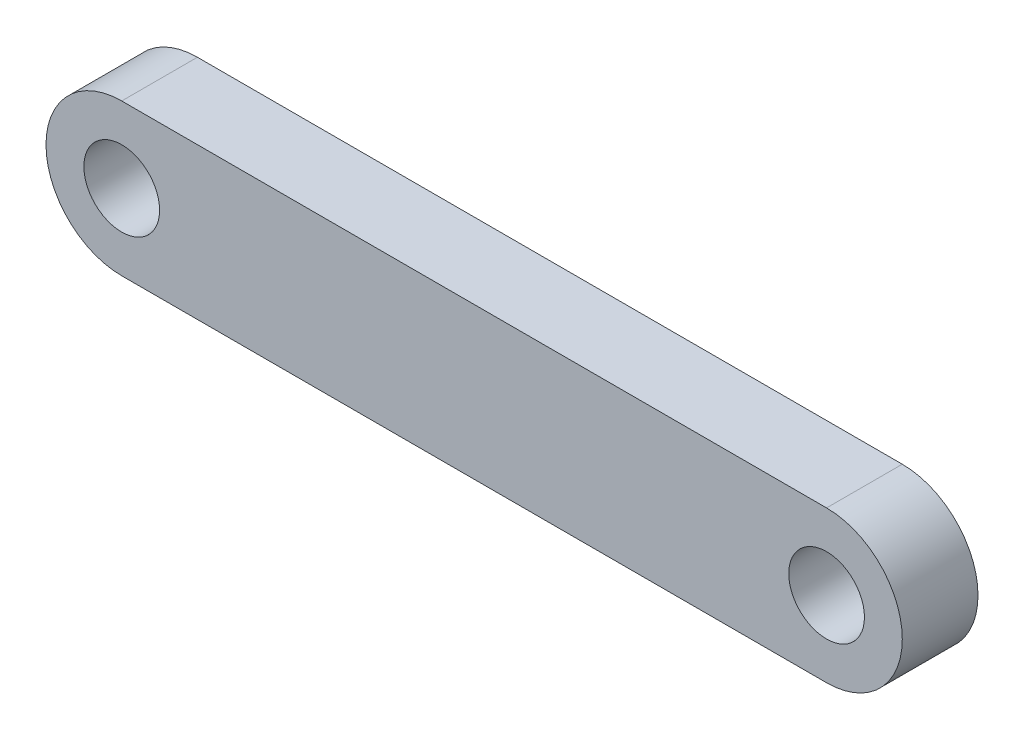
ISO-10303-21;
HEADER;
FILE_DESCRIPTION(('STEP AP214'),'2;1');
FILE_NAME('part.step','',(''),(''),'','','');
FILE_SCHEMA(('AUTOMOTIVE_DESIGN { 1 0 10303 214 1 1 1 1 }'));
ENDSEC;
DATA;
#1=APPLICATION_CONTEXT('core data for automotive mechanical design processes');
#2=APPLICATION_PROTOCOL_DEFINITION('international standard','automotive_design',2000,#1);
#3=PRODUCT_CONTEXT('',#1,'mechanical');
#4=PRODUCT('Part','Part','',(#3));
#5=PRODUCT_RELATED_PRODUCT_CATEGORY('part','',(#4));
#6=PRODUCT_DEFINITION_FORMATION('','',#4);
#7=PRODUCT_DEFINITION_CONTEXT('part definition',#1,'design');
#8=PRODUCT_DEFINITION('design','',#6,#7);
#9=PRODUCT_DEFINITION_SHAPE('','',#8);
#10=(LENGTH_UNIT() NAMED_UNIT(*) SI_UNIT(.MILLI.,.METRE.));
#11=(NAMED_UNIT(*) PLANE_ANGLE_UNIT() SI_UNIT($,.RADIAN.));
#12=(NAMED_UNIT(*) SI_UNIT($,.STERADIAN.) SOLID_ANGLE_UNIT());
#13=UNCERTAINTY_MEASURE_WITH_UNIT(LENGTH_MEASURE(1.E-05),#10,'distance_accuracy_value','');
#14=(GEOMETRIC_REPRESENTATION_CONTEXT(3) GLOBAL_UNCERTAINTY_ASSIGNED_CONTEXT((#13)) GLOBAL_UNIT_ASSIGNED_CONTEXT((#10,
#11,#12)) REPRESENTATION_CONTEXT('',''));
#15=CARTESIAN_POINT('',(0.,0.,0.));
#16=DIRECTION('',(0.,0.,1.));
#17=DIRECTION('',(1.,0.,0.));
#18=AXIS2_PLACEMENT_3D('',#15,#16,#17);
#19=CARTESIAN_POINT('',(0.,0.,2.));
#20=DIRECTION('',(0.,0.,1.));
#21=DIRECTION('',(1.,0.,0.));
#22=AXIS2_PLACEMENT_3D('',#19,#20,#21);
#23=PLANE('',#22);
#24=CARTESIAN_POINT('',(0.,0.,2.));
#25=DIRECTION('',(0.,0.,1.));
#26=DIRECTION('',(1.,0.,0.));
#27=AXIS2_PLACEMENT_3D('',#24,#25,#26);
#28=CIRCLE('',#27,1.);
#29=CARTESIAN_POINT('',(1.,0.,2.));
#30=VERTEX_POINT('',#29);
#31=EDGE_CURVE('E101',#30,#30,#28,.T.);
#32=ORIENTED_EDGE('',*,*,#31,.F.);
#33=EDGE_LOOP('',(#32));
#34=FACE_BOUND('',#33,.T.);
#35=CARTESIAN_POINT('',(0.,0.,2.));
#36=DIRECTION('',(0.,0.,1.));
#37=DIRECTION('',(1.,0.,0.));
#38=AXIS2_PLACEMENT_3D('',#35,#36,#37);
#39=CIRCLE('',#38,2.);
#40=CARTESIAN_POINT('',(0.,2.,2.));
#41=VERTEX_POINT('',#40);
#42=CARTESIAN_POINT('',(0.,-2.,2.));
#43=VERTEX_POINT('',#42);
#44=EDGE_CURVE('E86',#41,#43,#39,.T.);
#45=ORIENTED_EDGE('',*,*,#44,.T.);
#46=DIRECTION('',(1.,0.,0.));
#47=VECTOR('',#46,1.);
#48=CARTESIAN_POINT('',(0.,-2.,2.));
#49=LINE('',#48,#47);
#50=CARTESIAN_POINT('',(18.62,-2.,2.));
#51=VERTEX_POINT('',#50);
#52=EDGE_CURVE('E81',#43,#51,#49,.T.);
#53=ORIENTED_EDGE('',*,*,#52,.T.);
#54=CARTESIAN_POINT('',(18.62,0.,2.));
#55=DIRECTION('',(0.,0.,1.));
#56=DIRECTION('',(1.,0.,0.));
#57=AXIS2_PLACEMENT_3D('',#54,#55,#56);
#58=CIRCLE('',#57,2.);
#59=CARTESIAN_POINT('',(18.62,2.,2.));
#60=VERTEX_POINT('',#59);
#61=EDGE_CURVE('E84',#51,#60,#58,.T.);
#62=ORIENTED_EDGE('',*,*,#61,.T.);
#63=DIRECTION('',(-1.,0.,0.));
#64=VECTOR('',#63,1.);
#65=CARTESIAN_POINT('',(0.,2.,2.));
#66=LINE('',#65,#64);
#67=EDGE_CURVE('E51',#60,#41,#66,.T.);
#68=ORIENTED_EDGE('',*,*,#67,.T.);
#69=EDGE_LOOP('',(#45,#53,#62,#68));
#70=FACE_BOUND('',#69,.T.);
#71=CARTESIAN_POINT('',(18.62,0.,2.));
#72=DIRECTION('',(0.,0.,1.));
#73=DIRECTION('',(1.,0.,0.));
#74=AXIS2_PLACEMENT_3D('',#71,#72,#73);
#75=CIRCLE('',#74,1.);
#76=CARTESIAN_POINT('',(19.62,0.,2.));
#77=VERTEX_POINT('',#76);
#78=EDGE_CURVE('E116',#77,#77,#75,.T.);
#79=ORIENTED_EDGE('',*,*,#78,.F.);
#80=EDGE_LOOP('',(#79));
#81=FACE_BOUND('',#80,.T.);
#82=ADVANCED_FACE('F34',(#34,#70,#81),#23,.T.);
#83=CARTESIAN_POINT('',(0.,0.,0.));
#84=DIRECTION('',(0.,0.,1.));
#85=DIRECTION('',(1.,0.,0.));
#86=AXIS2_PLACEMENT_3D('',#83,#84,#85);
#87=PLANE('',#86);
#88=CARTESIAN_POINT('',(0.,0.,0.));
#89=DIRECTION('',(0.,0.,1.));
#90=DIRECTION('',(1.,0.,0.));
#91=AXIS2_PLACEMENT_3D('',#88,#89,#90);
#92=CIRCLE('',#91,2.);
#93=CARTESIAN_POINT('',(0.,2.,0.));
#94=VERTEX_POINT('',#93);
#95=CARTESIAN_POINT('',(0.,-2.,0.));
#96=VERTEX_POINT('',#95);
#97=EDGE_CURVE('E98',#94,#96,#92,.T.);
#98=ORIENTED_EDGE('',*,*,#97,.F.);
#99=DIRECTION('',(-1.,0.,0.));
#100=VECTOR('',#99,1.);
#101=CARTESIAN_POINT('',(0.,2.,0.));
#102=LINE('',#101,#100);
#103=CARTESIAN_POINT('',(18.62,2.,0.));
#104=VERTEX_POINT('',#103);
#105=EDGE_CURVE('E74',#104,#94,#102,.T.);
#106=ORIENTED_EDGE('',*,*,#105,.F.);
#107=CARTESIAN_POINT('',(18.62,0.,0.));
#108=DIRECTION('',(0.,0.,1.));
#109=DIRECTION('',(1.,0.,0.));
#110=AXIS2_PLACEMENT_3D('',#107,#108,#109);
#111=CIRCLE('',#110,2.);
#112=CARTESIAN_POINT('',(18.62,-2.,0.));
#113=VERTEX_POINT('',#112);
#114=EDGE_CURVE('E68',#113,#104,#111,.T.);
#115=ORIENTED_EDGE('',*,*,#114,.F.);
#116=DIRECTION('',(1.,0.,0.));
#117=VECTOR('',#116,1.);
#118=CARTESIAN_POINT('',(0.,-2.,0.));
#119=LINE('',#118,#117);
#120=EDGE_CURVE('E90',#96,#113,#119,.T.);
#121=ORIENTED_EDGE('',*,*,#120,.F.);
#122=EDGE_LOOP('',(#98,#106,#115,#121));
#123=FACE_BOUND('',#122,.T.);
#124=CARTESIAN_POINT('',(0.,0.,0.));
#125=DIRECTION('',(0.,0.,1.));
#126=DIRECTION('',(1.,0.,0.));
#127=AXIS2_PLACEMENT_3D('',#124,#125,#126);
#128=CIRCLE('',#127,1.);
#129=CARTESIAN_POINT('',(1.,0.,0.));
#130=VERTEX_POINT('',#129);
#131=EDGE_CURVE('E113',#130,#130,#128,.T.);
#132=ORIENTED_EDGE('',*,*,#131,.T.);
#133=EDGE_LOOP('',(#132));
#134=FACE_BOUND('',#133,.T.);
#135=CARTESIAN_POINT('',(18.62,0.,0.));
#136=DIRECTION('',(0.,0.,1.));
#137=DIRECTION('',(1.,0.,0.));
#138=AXIS2_PLACEMENT_3D('',#135,#136,#137);
#139=CIRCLE('',#138,1.);
#140=CARTESIAN_POINT('',(19.62,0.,0.));
#141=VERTEX_POINT('',#140);
#142=EDGE_CURVE('E119',#141,#141,#139,.T.);
#143=ORIENTED_EDGE('',*,*,#142,.T.);
#144=EDGE_LOOP('',(#143));
#145=FACE_BOUND('',#144,.T.);
#146=ADVANCED_FACE('F109',(#123,#134,#145),#87,.F.);
#147=CARTESIAN_POINT('',(0.,0.,2.));
#148=DIRECTION('',(0.,0.,-1.));
#149=DIRECTION('',(-1.,0.,0.));
#150=AXIS2_PLACEMENT_3D('',#147,#148,#149);
#151=CYLINDRICAL_SURFACE('',#150,2.);
#152=ORIENTED_EDGE('',*,*,#97,.T.);
#153=DIRECTION('',(0.,0.,-1.));
#154=VECTOR('',#153,1.);
#155=CARTESIAN_POINT('',(0.,-2.,2.));
#156=LINE('',#155,#154);
#157=EDGE_CURVE('E11',#43,#96,#156,.T.);
#158=ORIENTED_EDGE('',*,*,#157,.F.);
#159=ORIENTED_EDGE('',*,*,#44,.F.);
#160=DIRECTION('',(0.,0.,-1.));
#161=VECTOR('',#160,1.);
#162=CARTESIAN_POINT('',(0.,2.,2.));
#163=LINE('',#162,#161);
#164=EDGE_CURVE('E94',#41,#94,#163,.T.);
#165=ORIENTED_EDGE('',*,*,#164,.T.);
#166=EDGE_LOOP('',(#152,#158,#159,#165));
#167=FACE_BOUND('',#166,.T.);
#168=ADVANCED_FACE('F36',(#167),#151,.T.);
#169=CARTESIAN_POINT('',(0.,-2.,2.));
#170=DIRECTION('',(0.,1.,0.));
#171=DIRECTION('',(0.,0.,1.));
#172=AXIS2_PLACEMENT_3D('',#169,#170,#171);
#173=PLANE('',#172);
#174=ORIENTED_EDGE('',*,*,#120,.T.);
#175=DIRECTION('',(0.,0.,-1.));
#176=VECTOR('',#175,1.);
#177=CARTESIAN_POINT('',(18.62,-2.,2.));
#178=LINE('',#177,#176);
#179=EDGE_CURVE('E43',#51,#113,#178,.T.);
#180=ORIENTED_EDGE('',*,*,#179,.F.);
#181=ORIENTED_EDGE('',*,*,#52,.F.);
#182=ORIENTED_EDGE('',*,*,#157,.T.);
#183=EDGE_LOOP('',(#174,#180,#181,#182));
#184=FACE_BOUND('',#183,.T.);
#185=ADVANCED_FACE('F89',(#184),#173,.F.);
#186=CARTESIAN_POINT('',(18.62,0.,2.));
#187=DIRECTION('',(0.,0.,-1.));
#188=DIRECTION('',(-1.,0.,0.));
#189=AXIS2_PLACEMENT_3D('',#186,#187,#188);
#190=CYLINDRICAL_SURFACE('',#189,2.);
#191=ORIENTED_EDGE('',*,*,#114,.T.);
#192=DIRECTION('',(0.,0.,-1.));
#193=VECTOR('',#192,1.);
#194=CARTESIAN_POINT('',(18.62,2.,2.));
#195=LINE('',#194,#193);
#196=EDGE_CURVE('E91',#60,#104,#195,.T.);
#197=ORIENTED_EDGE('',*,*,#196,.F.);
#198=ORIENTED_EDGE('',*,*,#61,.F.);
#199=ORIENTED_EDGE('',*,*,#179,.T.);
#200=EDGE_LOOP('',(#191,#197,#198,#199));
#201=FACE_BOUND('',#200,.T.);
#202=ADVANCED_FACE('F92',(#201),#190,.T.);
#203=CARTESIAN_POINT('',(0.,2.,2.));
#204=DIRECTION('',(0.,-1.,0.));
#205=DIRECTION('',(0.,0.,-1.));
#206=AXIS2_PLACEMENT_3D('',#203,#204,#205);
#207=PLANE('',#206);
#208=ORIENTED_EDGE('',*,*,#105,.T.);
#209=ORIENTED_EDGE('',*,*,#164,.F.);
#210=ORIENTED_EDGE('',*,*,#67,.F.);
#211=ORIENTED_EDGE('',*,*,#196,.T.);
#212=EDGE_LOOP('',(#208,#209,#210,#211));
#213=FACE_BOUND('',#212,.T.);
#214=ADVANCED_FACE('F106',(#213),#207,.F.);
#215=CARTESIAN_POINT('',(0.,0.,2.));
#216=DIRECTION('',(0.,0.,-1.));
#217=DIRECTION('',(-1.,0.,0.));
#218=AXIS2_PLACEMENT_3D('',#215,#216,#217);
#219=CYLINDRICAL_SURFACE('',#218,1.);
#220=ORIENTED_EDGE('',*,*,#31,.T.);
#221=EDGE_LOOP('',(#220));
#222=FACE_BOUND('',#221,.T.);
#223=ORIENTED_EDGE('',*,*,#131,.F.);
#224=EDGE_LOOP('',(#223));
#225=FACE_BOUND('',#224,.T.);
#226=ADVANCED_FACE('F136',(#222,#225),#219,.F.);
#227=CARTESIAN_POINT('',(18.62,0.,2.));
#228=DIRECTION('',(0.,0.,-1.));
#229=DIRECTION('',(-1.,0.,0.));
#230=AXIS2_PLACEMENT_3D('',#227,#228,#229);
#231=CYLINDRICAL_SURFACE('',#230,1.);
#232=ORIENTED_EDGE('',*,*,#78,.T.);
#233=EDGE_LOOP('',(#232));
#234=FACE_BOUND('',#233,.T.);
#235=ORIENTED_EDGE('',*,*,#142,.F.);
#236=EDGE_LOOP('',(#235));
#237=FACE_BOUND('',#236,.T.);
#238=ADVANCED_FACE('F125',(#234,#237),#231,.F.);
#239=CLOSED_SHELL('',(#82,#146,#168,#185,#202,#214,#226,#238));
#240=MANIFOLD_SOLID_BREP('B2',#239);
#241=ADVANCED_BREP_SHAPE_REPRESENTATION('',(#18,#240),#14);
#242=SHAPE_DEFINITION_REPRESENTATION(#9,#241);
ENDSEC;
END-ISO-10303-21;
